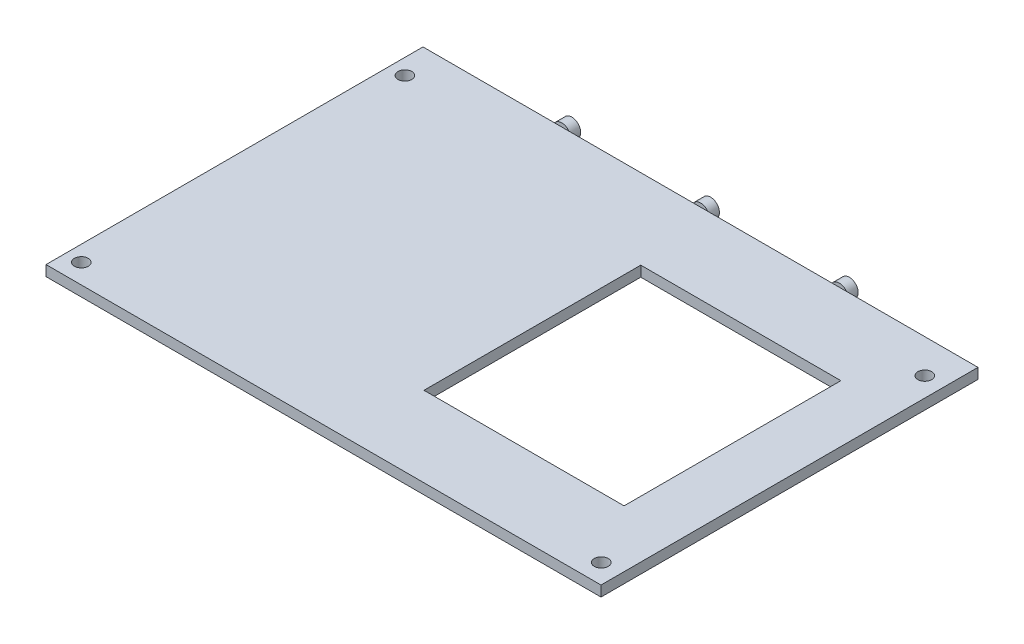
ISO-10303-21;
HEADER;
FILE_DESCRIPTION(('STEP AP214'),'2;1');
FILE_NAME('part.step','',(''),(''),'','','');
FILE_SCHEMA(('AUTOMOTIVE_DESIGN { 1 0 10303 214 1 1 1 1 }'));
ENDSEC;
DATA;
#1=APPLICATION_CONTEXT('core data for automotive mechanical design processes');
#2=APPLICATION_PROTOCOL_DEFINITION('international standard','automotive_design',2000,#1);
#3=PRODUCT_CONTEXT('',#1,'mechanical');
#4=PRODUCT('Part','Part','',(#3));
#5=PRODUCT_RELATED_PRODUCT_CATEGORY('part','',(#4));
#6=PRODUCT_DEFINITION_FORMATION('','',#4);
#7=PRODUCT_DEFINITION_CONTEXT('part definition',#1,'design');
#8=PRODUCT_DEFINITION('design','',#6,#7);
#9=PRODUCT_DEFINITION_SHAPE('','',#8);
#10=(LENGTH_UNIT() NAMED_UNIT(*) SI_UNIT(.MILLI.,.METRE.));
#11=(NAMED_UNIT(*) PLANE_ANGLE_UNIT() SI_UNIT($,.RADIAN.));
#12=(NAMED_UNIT(*) SI_UNIT($,.STERADIAN.) SOLID_ANGLE_UNIT());
#13=UNCERTAINTY_MEASURE_WITH_UNIT(LENGTH_MEASURE(1.E-05),#10,'distance_accuracy_value','');
#14=(GEOMETRIC_REPRESENTATION_CONTEXT(3) GLOBAL_UNCERTAINTY_ASSIGNED_CONTEXT((#13)) GLOBAL_UNIT_ASSIGNED_CONTEXT((#10,
#11,#12)) REPRESENTATION_CONTEXT('',''));
#15=CARTESIAN_POINT('',(0.,0.,0.));
#16=DIRECTION('',(0.,0.,1.));
#17=DIRECTION('',(1.,0.,0.));
#18=AXIS2_PLACEMENT_3D('',#15,#16,#17);
#19=CARTESIAN_POINT('',(0.,0.,0.));
#20=DIRECTION('',(0.,0.,1.));
#21=DIRECTION('',(1.,0.,0.));
#22=AXIS2_PLACEMENT_3D('',#19,#20,#21);
#23=PLANE('',#22);
#24=CARTESIAN_POINT('',(26.4999999999998,0.,0.));
#25=DIRECTION('',(0.,0.,-1.));
#26=DIRECTION('',(-1.,0.,0.));
#27=AXIS2_PLACEMENT_3D('',#24,#25,#26);
#28=CIRCLE('',#27,1.7);
#29=CARTESIAN_POINT('',(27.8747727084866,1.,0.));
#30=VERTEX_POINT('',#29);
#31=CARTESIAN_POINT('',(27.8747727084866,-1.,0.));
#32=VERTEX_POINT('',#31);
#33=EDGE_CURVE('E11',#30,#32,#28,.T.);
#34=ORIENTED_EDGE('',*,*,#33,.F.);
#35=DIRECTION('',(-1.,0.,0.));
#36=VECTOR('',#35,1.);
#37=CARTESIAN_POINT('',(-53.,1.,0.));
#38=LINE('',#37,#36);
#39=CARTESIAN_POINT('',(53.,1.,0.));
#40=VERTEX_POINT('',#39);
#41=EDGE_CURVE('E235',#40,#30,#38,.T.);
#42=ORIENTED_EDGE('',*,*,#41,.F.);
#43=DIRECTION('',(0.,1.,0.));
#44=VECTOR('',#43,1.);
#45=CARTESIAN_POINT('',(53.,1.,0.));
#46=LINE('',#45,#44);
#47=CARTESIAN_POINT('',(53.,-1.,0.));
#48=VERTEX_POINT('',#47);
#49=EDGE_CURVE('E219',#48,#40,#46,.T.);
#50=ORIENTED_EDGE('',*,*,#49,.F.);
#51=DIRECTION('',(1.,0.,0.));
#52=VECTOR('',#51,1.);
#53=CARTESIAN_POINT('',(-53.,-1.,0.));
#54=LINE('',#53,#52);
#55=EDGE_CURVE('E240',#32,#48,#54,.T.);
#56=ORIENTED_EDGE('',*,*,#55,.F.);
#57=EDGE_LOOP('',(#34,#42,#50,#56));
#58=FACE_BOUND('',#57,.T.);
#59=ADVANCED_FACE('F43',(#58),#23,.F.);
#60=CARTESIAN_POINT('',(-26.5000000000002,0.,0.));
#61=DIRECTION('',(0.,0.,-1.));
#62=DIRECTION('',(-1.,0.,0.));
#63=AXIS2_PLACEMENT_3D('',#60,#61,#62);
#64=CIRCLE('',#63,1.7);
#65=CARTESIAN_POINT('',(-25.1252272915134,1.,0.));
#66=VERTEX_POINT('',#65);
#67=CARTESIAN_POINT('',(-25.1252272915134,-1.,0.));
#68=VERTEX_POINT('',#67);
#69=EDGE_CURVE('E61',#66,#68,#64,.T.);
#70=ORIENTED_EDGE('',*,*,#69,.F.);
#71=CARTESIAN_POINT('',(-1.37477270848693,1.,0.));
#72=VERTEX_POINT('',#71);
#73=EDGE_CURVE('E151',#72,#66,#38,.T.);
#74=ORIENTED_EDGE('',*,*,#73,.F.);
#75=CARTESIAN_POINT('',(-1.80411241501588E-13,0.,0.));
#76=DIRECTION('',(0.,0.,-1.));
#77=DIRECTION('',(-1.,0.,0.));
#78=AXIS2_PLACEMENT_3D('',#75,#76,#77);
#79=CIRCLE('',#78,1.7);
#80=CARTESIAN_POINT('',(-1.37477270848694,-1.,0.));
#81=VERTEX_POINT('',#80);
#82=EDGE_CURVE('E160',#81,#72,#79,.T.);
#83=ORIENTED_EDGE('',*,*,#82,.F.);
#84=EDGE_CURVE('E361',#68,#81,#54,.T.);
#85=ORIENTED_EDGE('',*,*,#84,.F.);
#86=EDGE_LOOP('',(#70,#74,#83,#85));
#87=FACE_BOUND('',#86,.T.);
#88=ADVANCED_FACE('F159',(#87),#23,.F.);
#89=CARTESIAN_POINT('',(25.1252272915131,-1.,0.));
#90=VERTEX_POINT('',#89);
#91=CARTESIAN_POINT('',(25.1252272915131,1.,0.));
#92=VERTEX_POINT('',#91);
#93=EDGE_CURVE('E52',#90,#92,#28,.T.);
#94=ORIENTED_EDGE('',*,*,#93,.F.);
#95=CARTESIAN_POINT('',(1.37477270848658,-1.,0.));
#96=VERTEX_POINT('',#95);
#97=EDGE_CURVE('E325',#96,#90,#54,.T.);
#98=ORIENTED_EDGE('',*,*,#97,.F.);
#99=CARTESIAN_POINT('',(1.37477270848657,1.,0.));
#100=VERTEX_POINT('',#99);
#101=EDGE_CURVE('E69',#100,#96,#79,.T.);
#102=ORIENTED_EDGE('',*,*,#101,.F.);
#103=EDGE_CURVE('E153',#92,#100,#38,.T.);
#104=ORIENTED_EDGE('',*,*,#103,.F.);
#105=EDGE_LOOP('',(#94,#98,#102,#104));
#106=FACE_BOUND('',#105,.T.);
#107=ADVANCED_FACE('F300',(#106),#23,.F.);
#108=CARTESIAN_POINT('',(53.,1.,72.));
#109=DIRECTION('',(-1.,0.,0.));
#110=DIRECTION('',(0.,-1.,0.));
#111=AXIS2_PLACEMENT_3D('',#108,#109,#110);
#112=PLANE('',#111);
#113=ORIENTED_EDGE('',*,*,#49,.T.);
#114=DIRECTION('',(0.,0.,-1.));
#115=VECTOR('',#114,1.);
#116=CARTESIAN_POINT('',(53.,1.,72.));
#117=LINE('',#116,#115);
#118=CARTESIAN_POINT('',(53.,1.,72.));
#119=VERTEX_POINT('',#118);
#120=EDGE_CURVE('E252',#119,#40,#117,.T.);
#121=ORIENTED_EDGE('',*,*,#120,.F.);
#122=DIRECTION('',(0.,1.,0.));
#123=VECTOR('',#122,1.);
#124=CARTESIAN_POINT('',(53.,1.,72.));
#125=LINE('',#124,#123);
#126=CARTESIAN_POINT('',(53.,-1.,72.));
#127=VERTEX_POINT('',#126);
#128=EDGE_CURVE('E222',#127,#119,#125,.T.);
#129=ORIENTED_EDGE('',*,*,#128,.F.);
#130=DIRECTION('',(0.,0.,-1.));
#131=VECTOR('',#130,1.);
#132=CARTESIAN_POINT('',(53.,-1.,72.));
#133=LINE('',#132,#131);
#134=EDGE_CURVE('E232',#127,#48,#133,.T.);
#135=ORIENTED_EDGE('',*,*,#134,.T.);
#136=EDGE_LOOP('',(#113,#121,#129,#135));
#137=FACE_BOUND('',#136,.T.);
#138=ADVANCED_FACE('F45',(#137),#112,.F.);
#139=CARTESIAN_POINT('',(-53.,1.,72.));
#140=DIRECTION('',(0.,-1.,0.));
#141=DIRECTION('',(0.,0.,-1.));
#142=AXIS2_PLACEMENT_3D('',#139,#140,#141);
#143=PLANE('',#142);
#144=DIRECTION('',(-1.,0.,0.));
#145=VECTOR('',#144,1.);
#146=CARTESIAN_POINT('',(3.88949849527973,1.,15.2958453329513));
#147=LINE('',#146,#145);
#148=CARTESIAN_POINT('',(42.1105015047203,1.,15.2958453329513));
#149=VERTEX_POINT('',#148);
#150=CARTESIAN_POINT('',(3.88949849527973,1.,15.2958453329513));
#151=VERTEX_POINT('',#150);
#152=EDGE_CURVE('E179',#149,#151,#147,.T.);
#153=ORIENTED_EDGE('',*,*,#152,.F.);
#154=DIRECTION('',(0.,0.,-1.));
#155=VECTOR('',#154,1.);
#156=CARTESIAN_POINT('',(42.1105015047203,1.,15.2958453329513));
#157=LINE('',#156,#155);
#158=CARTESIAN_POINT('',(42.1105015047203,1.,56.7041546670487));
#159=VERTEX_POINT('',#158);
#160=EDGE_CURVE('E173',#159,#149,#157,.T.);
#161=ORIENTED_EDGE('',*,*,#160,.F.);
#162=DIRECTION('',(1.,0.,0.));
#163=VECTOR('',#162,1.);
#164=CARTESIAN_POINT('',(3.88949849527974,1.,56.7041546670487));
#165=LINE('',#164,#163);
#166=CARTESIAN_POINT('',(3.88949849527974,1.,56.7041546670487));
#167=VERTEX_POINT('',#166);
#168=EDGE_CURVE('E185',#167,#159,#165,.T.);
#169=ORIENTED_EDGE('',*,*,#168,.F.);
#170=DIRECTION('',(0.,0.,1.));
#171=VECTOR('',#170,1.);
#172=CARTESIAN_POINT('',(3.88949849527973,1.,15.2958453329513));
#173=LINE('',#172,#171);
#174=EDGE_CURVE('E182',#151,#167,#173,.T.);
#175=ORIENTED_EDGE('',*,*,#174,.F.);
#176=EDGE_LOOP('',(#153,#161,#169,#175));
#177=FACE_BOUND('',#176,.T.);
#178=CARTESIAN_POINT('',(49.2951219272078,1.,6.45069322686598));
#179=DIRECTION('',(0.,1.,0.));
#180=DIRECTION('',(0.,0.,1.));
#181=AXIS2_PLACEMENT_3D('',#178,#179,#180);
#182=CIRCLE('',#181,1.325);
#183=CARTESIAN_POINT('',(49.2951219272078,1.,7.77569322686598));
#184=VERTEX_POINT('',#183);
#185=EDGE_CURVE('E191',#184,#184,#182,.T.);
#186=ORIENTED_EDGE('',*,*,#185,.F.);
#187=EDGE_LOOP('',(#186));
#188=FACE_BOUND('',#187,.T.);
#189=CARTESIAN_POINT('',(49.2951219272078,1.,68.250693226866));
#190=DIRECTION('',(0.,1.,0.));
#191=DIRECTION('',(0.,0.,1.));
#192=AXIS2_PLACEMENT_3D('',#189,#190,#191);
#193=CIRCLE('',#192,1.325);
#194=CARTESIAN_POINT('',(49.2951219272078,1.,69.575693226866));
#195=VERTEX_POINT('',#194);
#196=EDGE_CURVE('E208',#195,#195,#193,.T.);
#197=ORIENTED_EDGE('',*,*,#196,.F.);
#198=EDGE_LOOP('',(#197));
#199=FACE_BOUND('',#198,.T.);
#200=CARTESIAN_POINT('',(-50.0048780727922,1.,68.250693226866));
#201=DIRECTION('',(0.,1.,0.));
#202=DIRECTION('',(0.,0.,1.));
#203=AXIS2_PLACEMENT_3D('',#200,#201,#202);
#204=CIRCLE('',#203,1.325);
#205=CARTESIAN_POINT('',(-50.0048780727922,1.,69.575693226866));
#206=VERTEX_POINT('',#205);
#207=EDGE_CURVE('E202',#206,#206,#204,.T.);
#208=ORIENTED_EDGE('',*,*,#207,.F.);
#209=EDGE_LOOP('',(#208));
#210=FACE_BOUND('',#209,.T.);
#211=CARTESIAN_POINT('',(-50.0048780727922,1.,6.45069322686598));
#212=DIRECTION('',(0.,1.,0.));
#213=DIRECTION('',(0.,0.,1.));
#214=AXIS2_PLACEMENT_3D('',#211,#212,#213);
#215=CIRCLE('',#214,1.325);
#216=CARTESIAN_POINT('',(-50.0048780727922,1.,7.77569322686598));
#217=VERTEX_POINT('',#216);
#218=EDGE_CURVE('E201',#217,#217,#215,.T.);
#219=ORIENTED_EDGE('',*,*,#218,.F.);
#220=EDGE_LOOP('',(#219));
#221=FACE_BOUND('',#220,.T.);
#222=ORIENTED_EDGE('',*,*,#41,.T.);
#223=EDGE_CURVE('E238',#30,#92,#38,.T.);
#224=ORIENTED_EDGE('',*,*,#223,.T.);
#225=ORIENTED_EDGE('',*,*,#103,.T.);
#226=EDGE_CURVE('E148',#100,#72,#38,.T.);
#227=ORIENTED_EDGE('',*,*,#226,.T.);
#228=ORIENTED_EDGE('',*,*,#73,.T.);
#229=CARTESIAN_POINT('',(-27.8747727084869,1.,0.));
#230=VERTEX_POINT('',#229);
#231=EDGE_CURVE('E162',#66,#230,#38,.T.);
#232=ORIENTED_EDGE('',*,*,#231,.T.);
#233=CARTESIAN_POINT('',(-53.,1.,0.));
#234=VERTEX_POINT('',#233);
#235=EDGE_CURVE('E234',#230,#234,#38,.T.);
#236=ORIENTED_EDGE('',*,*,#235,.T.);
#237=DIRECTION('',(0.,0.,-1.));
#238=VECTOR('',#237,1.);
#239=CARTESIAN_POINT('',(-53.,1.,72.));
#240=LINE('',#239,#238);
#241=CARTESIAN_POINT('',(-53.,1.,72.));
#242=VERTEX_POINT('',#241);
#243=EDGE_CURVE('E249',#242,#234,#240,.T.);
#244=ORIENTED_EDGE('',*,*,#243,.F.);
#245=DIRECTION('',(-1.,0.,0.));
#246=VECTOR('',#245,1.);
#247=CARTESIAN_POINT('',(-53.,1.,72.));
#248=LINE('',#247,#246);
#249=EDGE_CURVE('E225',#119,#242,#248,.T.);
#250=ORIENTED_EDGE('',*,*,#249,.F.);
#251=ORIENTED_EDGE('',*,*,#120,.T.);
#252=EDGE_LOOP('',(#222,#224,#225,#227,#228,#232,#236,#244,#250,#251));
#253=FACE_BOUND('',#252,.T.);
#254=ADVANCED_FACE('F150',(#177,#188,#199,#210,#221,#253),#143,.F.);
#255=CARTESIAN_POINT('',(-53.,1.,72.));
#256=DIRECTION('',(1.,0.,0.));
#257=DIRECTION('',(0.,0.,-1.));
#258=AXIS2_PLACEMENT_3D('',#255,#256,#257);
#259=PLANE('',#258);
#260=DIRECTION('',(0.,-1.,0.));
#261=VECTOR('',#260,1.);
#262=CARTESIAN_POINT('',(-53.,1.,0.));
#263=LINE('',#262,#261);
#264=CARTESIAN_POINT('',(-53.,-1.,0.));
#265=VERTEX_POINT('',#264);
#266=EDGE_CURVE('E237',#234,#265,#263,.T.);
#267=ORIENTED_EDGE('',*,*,#266,.T.);
#268=DIRECTION('',(0.,0.,-1.));
#269=VECTOR('',#268,1.);
#270=CARTESIAN_POINT('',(-53.,-1.,72.));
#271=LINE('',#270,#269);
#272=CARTESIAN_POINT('',(-53.,-1.,72.));
#273=VERTEX_POINT('',#272);
#274=EDGE_CURVE('E246',#273,#265,#271,.T.);
#275=ORIENTED_EDGE('',*,*,#274,.F.);
#276=DIRECTION('',(0.,-1.,0.));
#277=VECTOR('',#276,1.);
#278=CARTESIAN_POINT('',(-53.,1.,72.));
#279=LINE('',#278,#277);
#280=EDGE_CURVE('E228',#242,#273,#279,.T.);
#281=ORIENTED_EDGE('',*,*,#280,.F.);
#282=ORIENTED_EDGE('',*,*,#243,.T.);
#283=EDGE_LOOP('',(#267,#275,#281,#282));
#284=FACE_BOUND('',#283,.T.);
#285=ADVANCED_FACE('F547',(#284),#259,.F.);
#286=CARTESIAN_POINT('',(-53.,-1.,72.));
#287=DIRECTION('',(0.,1.,0.));
#288=DIRECTION('',(0.,0.,1.));
#289=AXIS2_PLACEMENT_3D('',#286,#287,#288);
#290=PLANE('',#289);
#291=DIRECTION('',(1.,0.,0.));
#292=VECTOR('',#291,1.);
#293=CARTESIAN_POINT('',(-53.,-1.,56.7041546670487));
#294=LINE('',#293,#292);
#295=CARTESIAN_POINT('',(3.88949849527974,-0.999999999999999,56.7041546670487));
#296=VERTEX_POINT('',#295);
#297=CARTESIAN_POINT('',(42.1105015047203,-0.999999999999999,56.7041546670487));
#298=VERTEX_POINT('',#297);
#299=EDGE_CURVE('E260',#296,#298,#294,.T.);
#300=ORIENTED_EDGE('',*,*,#299,.T.);
#301=DIRECTION('',(0.,0.,-1.));
#302=VECTOR('',#301,1.);
#303=CARTESIAN_POINT('',(42.1105015047203,-1.,72.));
#304=LINE('',#303,#302);
#305=CARTESIAN_POINT('',(42.1105015047203,-0.999999999999999,15.2958453329513));
#306=VERTEX_POINT('',#305);
#307=EDGE_CURVE('E47',#298,#306,#304,.T.);
#308=ORIENTED_EDGE('',*,*,#307,.T.);
#309=DIRECTION('',(-1.,0.,0.));
#310=VECTOR('',#309,1.);
#311=CARTESIAN_POINT('',(-53.,-1.,15.2958453329513));
#312=LINE('',#311,#310);
#313=CARTESIAN_POINT('',(3.88949849527973,-1.,15.2958453329513));
#314=VERTEX_POINT('',#313);
#315=EDGE_CURVE('E255',#306,#314,#312,.T.);
#316=ORIENTED_EDGE('',*,*,#315,.T.);
#317=DIRECTION('',(0.,0.,1.));
#318=VECTOR('',#317,1.);
#319=CARTESIAN_POINT('',(3.88949849527974,-1.,72.));
#320=LINE('',#319,#318);
#321=EDGE_CURVE('E258',#314,#296,#320,.T.);
#322=ORIENTED_EDGE('',*,*,#321,.T.);
#323=EDGE_LOOP('',(#300,#308,#316,#322));
#324=FACE_BOUND('',#323,.T.);
#325=CARTESIAN_POINT('',(49.2951219272078,-1.,6.45069322686598));
#326=DIRECTION('',(0.,1.,0.));
#327=DIRECTION('',(0.,0.,1.));
#328=AXIS2_PLACEMENT_3D('',#325,#326,#327);
#329=CIRCLE('',#328,1.325);
#330=CARTESIAN_POINT('',(49.2951219272078,-1.,7.77569322686598));
#331=VERTEX_POINT('',#330);
#332=EDGE_CURVE('E211',#331,#331,#329,.T.);
#333=ORIENTED_EDGE('',*,*,#332,.T.);
#334=EDGE_LOOP('',(#333));
#335=FACE_BOUND('',#334,.T.);
#336=CARTESIAN_POINT('',(49.2951219272078,-1.,68.250693226866));
#337=DIRECTION('',(0.,1.,0.));
#338=DIRECTION('',(0.,0.,1.));
#339=AXIS2_PLACEMENT_3D('',#336,#337,#338);
#340=CIRCLE('',#339,1.325);
#341=CARTESIAN_POINT('',(49.2951219272078,-1.,69.575693226866));
#342=VERTEX_POINT('',#341);
#343=EDGE_CURVE('E205',#342,#342,#340,.T.);
#344=ORIENTED_EDGE('',*,*,#343,.T.);
#345=EDGE_LOOP('',(#344));
#346=FACE_BOUND('',#345,.T.);
#347=CARTESIAN_POINT('',(-50.0048780727922,-1.,68.250693226866));
#348=DIRECTION('',(0.,1.,0.));
#349=DIRECTION('',(0.,0.,1.));
#350=AXIS2_PLACEMENT_3D('',#347,#348,#349);
#351=CIRCLE('',#350,1.325);
#352=CARTESIAN_POINT('',(-50.0048780727922,-1.,69.575693226866));
#353=VERTEX_POINT('',#352);
#354=EDGE_CURVE('E198',#353,#353,#351,.T.);
#355=ORIENTED_EDGE('',*,*,#354,.T.);
#356=EDGE_LOOP('',(#355));
#357=FACE_BOUND('',#356,.T.);
#358=CARTESIAN_POINT('',(-50.0048780727922,-1.,6.45069322686598));
#359=DIRECTION('',(0.,1.,0.));
#360=DIRECTION('',(0.,0.,1.));
#361=AXIS2_PLACEMENT_3D('',#358,#359,#360);
#362=CIRCLE('',#361,1.325);
#363=CARTESIAN_POINT('',(-50.0048780727922,-1.,7.77569322686598));
#364=VERTEX_POINT('',#363);
#365=EDGE_CURVE('E216',#364,#364,#362,.T.);
#366=ORIENTED_EDGE('',*,*,#365,.T.);
#367=EDGE_LOOP('',(#366));
#368=FACE_BOUND('',#367,.T.);
#369=CARTESIAN_POINT('',(-27.8747727084869,-1.,0.));
#370=VERTEX_POINT('',#369);
#371=EDGE_CURVE('E226',#265,#370,#54,.T.);
#372=ORIENTED_EDGE('',*,*,#371,.T.);
#373=EDGE_CURVE('E243',#370,#68,#54,.T.);
#374=ORIENTED_EDGE('',*,*,#373,.T.);
#375=ORIENTED_EDGE('',*,*,#84,.T.);
#376=EDGE_CURVE('E338',#81,#96,#54,.T.);
#377=ORIENTED_EDGE('',*,*,#376,.T.);
#378=ORIENTED_EDGE('',*,*,#97,.T.);
#379=EDGE_CURVE('E335',#90,#32,#54,.T.);
#380=ORIENTED_EDGE('',*,*,#379,.T.);
#381=ORIENTED_EDGE('',*,*,#55,.T.);
#382=ORIENTED_EDGE('',*,*,#134,.F.);
#383=DIRECTION('',(1.,0.,0.));
#384=VECTOR('',#383,1.);
#385=CARTESIAN_POINT('',(-53.,-1.,72.));
#386=LINE('',#385,#384);
#387=EDGE_CURVE('E230',#273,#127,#386,.T.);
#388=ORIENTED_EDGE('',*,*,#387,.F.);
#389=ORIENTED_EDGE('',*,*,#274,.T.);
#390=EDGE_LOOP('',(#372,#374,#375,#377,#378,#380,#381,#382,#388,#389));
#391=FACE_BOUND('',#390,.T.);
#392=ADVANCED_FACE('F264',(#324,#335,#346,#357,#368,#391),#290,.F.);
#393=CARTESIAN_POINT('',(0.,0.,72.));
#394=DIRECTION('',(0.,0.,1.));
#395=DIRECTION('',(1.,0.,0.));
#396=AXIS2_PLACEMENT_3D('',#393,#394,#395);
#397=PLANE('',#396);
#398=ORIENTED_EDGE('',*,*,#128,.T.);
#399=ORIENTED_EDGE('',*,*,#249,.T.);
#400=ORIENTED_EDGE('',*,*,#280,.T.);
#401=ORIENTED_EDGE('',*,*,#387,.T.);
#402=EDGE_LOOP('',(#398,#399,#400,#401));
#403=FACE_BOUND('',#402,.T.);
#404=ADVANCED_FACE('F305',(#403),#397,.T.);
#405=EDGE_CURVE('E350',#370,#230,#64,.T.);
#406=ORIENTED_EDGE('',*,*,#405,.F.);
#407=ORIENTED_EDGE('',*,*,#371,.F.);
#408=ORIENTED_EDGE('',*,*,#266,.F.);
#409=ORIENTED_EDGE('',*,*,#235,.F.);
#410=EDGE_LOOP('',(#406,#407,#408,#409));
#411=FACE_BOUND('',#410,.T.);
#412=ADVANCED_FACE('F296',(#411),#23,.F.);
#413=CARTESIAN_POINT('',(-50.0048780727922,-1.,6.45069322686598));
#414=DIRECTION('',(0.,1.,0.));
#415=DIRECTION('',(0.,0.,1.));
#416=AXIS2_PLACEMENT_3D('',#413,#414,#415);
#417=CYLINDRICAL_SURFACE('',#416,1.325);
#418=ORIENTED_EDGE('',*,*,#365,.F.);
#419=EDGE_LOOP('',(#418));
#420=FACE_BOUND('',#419,.T.);
#421=ORIENTED_EDGE('',*,*,#218,.T.);
#422=EDGE_LOOP('',(#421));
#423=FACE_BOUND('',#422,.T.);
#424=ADVANCED_FACE('F304',(#420,#423),#417,.F.);
#425=CARTESIAN_POINT('',(-50.0048780727922,-1.,68.250693226866));
#426=DIRECTION('',(0.,1.,0.));
#427=DIRECTION('',(0.,0.,1.));
#428=AXIS2_PLACEMENT_3D('',#425,#426,#427);
#429=CYLINDRICAL_SURFACE('',#428,1.325);
#430=ORIENTED_EDGE('',*,*,#354,.F.);
#431=EDGE_LOOP('',(#430));
#432=FACE_BOUND('',#431,.T.);
#433=ORIENTED_EDGE('',*,*,#207,.T.);
#434=EDGE_LOOP('',(#433));
#435=FACE_BOUND('',#434,.T.);
#436=ADVANCED_FACE('F312',(#432,#435),#429,.F.);
#437=CARTESIAN_POINT('',(49.2951219272078,-1.,68.250693226866));
#438=DIRECTION('',(0.,1.,0.));
#439=DIRECTION('',(0.,0.,1.));
#440=AXIS2_PLACEMENT_3D('',#437,#438,#439);
#441=CYLINDRICAL_SURFACE('',#440,1.325);
#442=ORIENTED_EDGE('',*,*,#343,.F.);
#443=EDGE_LOOP('',(#442));
#444=FACE_BOUND('',#443,.T.);
#445=ORIENTED_EDGE('',*,*,#196,.T.);
#446=EDGE_LOOP('',(#445));
#447=FACE_BOUND('',#446,.T.);
#448=ADVANCED_FACE('F509',(#444,#447),#441,.F.);
#449=CARTESIAN_POINT('',(49.2951219272078,-1.,6.45069322686598));
#450=DIRECTION('',(0.,1.,0.));
#451=DIRECTION('',(0.,0.,1.));
#452=AXIS2_PLACEMENT_3D('',#449,#450,#451);
#453=CYLINDRICAL_SURFACE('',#452,1.325);
#454=ORIENTED_EDGE('',*,*,#332,.F.);
#455=EDGE_LOOP('',(#454));
#456=FACE_BOUND('',#455,.T.);
#457=ORIENTED_EDGE('',*,*,#185,.T.);
#458=EDGE_LOOP('',(#457));
#459=FACE_BOUND('',#458,.T.);
#460=ADVANCED_FACE('F501',(#456,#459),#453,.F.);
#461=CARTESIAN_POINT('',(42.1105015047203,-9.,15.2958453329513));
#462=DIRECTION('',(1.,0.,0.));
#463=DIRECTION('',(0.,0.,-1.));
#464=AXIS2_PLACEMENT_3D('',#461,#462,#463);
#465=PLANE('',#464);
#466=DIRECTION('',(0.,1.,0.));
#467=VECTOR('',#466,1.);
#468=CARTESIAN_POINT('',(42.1105015047203,-9.,56.7041546670487));
#469=LINE('',#468,#467);
#470=EDGE_CURVE('E189',#298,#159,#469,.T.);
#471=ORIENTED_EDGE('',*,*,#470,.T.);
#472=ORIENTED_EDGE('',*,*,#160,.T.);
#473=DIRECTION('',(0.,1.,0.));
#474=VECTOR('',#473,1.);
#475=CARTESIAN_POINT('',(42.1105015047203,-9.,15.2958453329513));
#476=LINE('',#475,#474);
#477=EDGE_CURVE('E188',#306,#149,#476,.T.);
#478=ORIENTED_EDGE('',*,*,#477,.F.);
#479=ORIENTED_EDGE('',*,*,#307,.F.);
#480=EDGE_LOOP('',(#471,#472,#478,#479));
#481=FACE_BOUND('',#480,.T.);
#482=ADVANCED_FACE('F269',(#481),#465,.F.);
#483=CARTESIAN_POINT('',(3.88949849527974,-9.,56.7041546670487));
#484=DIRECTION('',(0.,0.,1.));
#485=DIRECTION('',(1.,0.,0.));
#486=AXIS2_PLACEMENT_3D('',#483,#484,#485);
#487=PLANE('',#486);
#488=DIRECTION('',(0.,1.,0.));
#489=VECTOR('',#488,1.);
#490=CARTESIAN_POINT('',(3.88949849527974,-9.,56.7041546670487));
#491=LINE('',#490,#489);
#492=EDGE_CURVE('E192',#296,#167,#491,.T.);
#493=ORIENTED_EDGE('',*,*,#492,.T.);
#494=ORIENTED_EDGE('',*,*,#168,.T.);
#495=ORIENTED_EDGE('',*,*,#470,.F.);
#496=ORIENTED_EDGE('',*,*,#299,.F.);
#497=EDGE_LOOP('',(#493,#494,#495,#496));
#498=FACE_BOUND('',#497,.T.);
#499=ADVANCED_FACE('F271',(#498),#487,.F.);
#500=CARTESIAN_POINT('',(3.88949849527973,-9.,15.2958453329513));
#501=DIRECTION('',(-1.,0.,0.));
#502=DIRECTION('',(0.,0.,1.));
#503=AXIS2_PLACEMENT_3D('',#500,#501,#502);
#504=PLANE('',#503);
#505=DIRECTION('',(0.,1.,0.));
#506=VECTOR('',#505,1.);
#507=CARTESIAN_POINT('',(3.88949849527973,-9.,15.2958453329513));
#508=LINE('',#507,#506);
#509=EDGE_CURVE('E194',#314,#151,#508,.T.);
#510=ORIENTED_EDGE('',*,*,#509,.T.);
#511=ORIENTED_EDGE('',*,*,#174,.T.);
#512=ORIENTED_EDGE('',*,*,#492,.F.);
#513=ORIENTED_EDGE('',*,*,#321,.F.);
#514=EDGE_LOOP('',(#510,#511,#512,#513));
#515=FACE_BOUND('',#514,.T.);
#516=ADVANCED_FACE('F283',(#515),#504,.F.);
#517=CARTESIAN_POINT('',(3.88949849527973,-9.,15.2958453329513));
#518=DIRECTION('',(0.,0.,-1.));
#519=DIRECTION('',(-1.,0.,0.));
#520=AXIS2_PLACEMENT_3D('',#517,#518,#519);
#521=PLANE('',#520);
#522=ORIENTED_EDGE('',*,*,#477,.T.);
#523=ORIENTED_EDGE('',*,*,#152,.T.);
#524=ORIENTED_EDGE('',*,*,#509,.F.);
#525=ORIENTED_EDGE('',*,*,#315,.F.);
#526=EDGE_LOOP('',(#522,#523,#524,#525));
#527=FACE_BOUND('',#526,.T.);
#528=ADVANCED_FACE('F280',(#527),#521,.F.);
#529=CARTESIAN_POINT('',(-1.80411241501588E-13,0.,0.));
#530=DIRECTION('',(0.,0.,-1.));
#531=DIRECTION('',(-1.,0.,0.));
#532=AXIS2_PLACEMENT_3D('',#529,#530,#531);
#533=PLANE('',#532);
#534=ORIENTED_EDGE('',*,*,#376,.F.);
#535=EDGE_CURVE('E168',#96,#81,#79,.T.);
#536=ORIENTED_EDGE('',*,*,#535,.F.);
#537=EDGE_LOOP('',(#534,#536));
#538=FACE_BOUND('',#537,.T.);
#539=ADVANCED_FACE('F290',(#538),#533,.F.);
#540=CARTESIAN_POINT('',(-1.80411241501588E-13,0.,-1.92));
#541=DIRECTION('',(0.,0.,1.));
#542=DIRECTION('',(1.,0.,0.));
#543=AXIS2_PLACEMENT_3D('',#540,#541,#542);
#544=CYLINDRICAL_SURFACE('',#543,1.7);
#545=CARTESIAN_POINT('',(-1.80411241501588E-13,0.,-1.92));
#546=DIRECTION('',(0.,0.,-1.));
#547=DIRECTION('',(-1.,0.,0.));
#548=AXIS2_PLACEMENT_3D('',#545,#546,#547);
#549=CIRCLE('',#548,1.7);
#550=CARTESIAN_POINT('',(-1.70000000000018,0.,-1.92));
#551=VERTEX_POINT('',#550);
#552=EDGE_CURVE('E171',#551,#551,#549,.T.);
#553=ORIENTED_EDGE('',*,*,#552,.F.);
#554=EDGE_LOOP('',(#553));
#555=FACE_BOUND('',#554,.T.);
#556=EDGE_CURVE('E166',#72,#100,#79,.T.);
#557=ORIENTED_EDGE('',*,*,#556,.T.);
#558=ORIENTED_EDGE('',*,*,#101,.T.);
#559=ORIENTED_EDGE('',*,*,#535,.T.);
#560=ORIENTED_EDGE('',*,*,#82,.T.);
#561=EDGE_LOOP('',(#557,#558,#559,#560));
#562=FACE_BOUND('',#561,.T.);
#563=ADVANCED_FACE('F165',(#555,#562),#544,.T.);
#564=CARTESIAN_POINT('',(-1.80411241501588E-13,0.,-1.92));
#565=DIRECTION('',(0.,0.,-1.));
#566=DIRECTION('',(-1.,0.,0.));
#567=AXIS2_PLACEMENT_3D('',#564,#565,#566);
#568=PLANE('',#567);
#569=ORIENTED_EDGE('',*,*,#552,.T.);
#570=EDGE_LOOP('',(#569));
#571=FACE_BOUND('',#570,.T.);
#572=ADVANCED_FACE('F367',(#571),#568,.T.);
#573=ORIENTED_EDGE('',*,*,#226,.F.);
#574=ORIENTED_EDGE('',*,*,#556,.F.);
#575=EDGE_LOOP('',(#573,#574));
#576=FACE_BOUND('',#575,.T.);
#577=ADVANCED_FACE('F170',(#576),#533,.F.);
#578=CARTESIAN_POINT('',(-26.5000000000002,0.,0.));
#579=DIRECTION('',(0.,0.,-1.));
#580=DIRECTION('',(-1.,0.,0.));
#581=AXIS2_PLACEMENT_3D('',#578,#579,#580);
#582=PLANE('',#581);
#583=ORIENTED_EDGE('',*,*,#373,.F.);
#584=EDGE_CURVE('E348',#68,#370,#64,.T.);
#585=ORIENTED_EDGE('',*,*,#584,.F.);
#586=EDGE_LOOP('',(#583,#585));
#587=FACE_BOUND('',#586,.T.);
#588=ADVANCED_FACE('F359',(#587),#582,.F.);
#589=CARTESIAN_POINT('',(-26.5000000000002,0.,-1.92));
#590=DIRECTION('',(0.,0.,1.));
#591=DIRECTION('',(1.,0.,0.));
#592=AXIS2_PLACEMENT_3D('',#589,#590,#591);
#593=CYLINDRICAL_SURFACE('',#592,1.7);
#594=CARTESIAN_POINT('',(-26.5000000000002,0.,-1.92));
#595=DIRECTION('',(0.,0.,-1.));
#596=DIRECTION('',(-1.,0.,0.));
#597=AXIS2_PLACEMENT_3D('',#594,#595,#596);
#598=CIRCLE('',#597,1.7);
#599=CARTESIAN_POINT('',(-28.2000000000002,0.,-1.92));
#600=VERTEX_POINT('',#599);
#601=EDGE_CURVE('E343',#600,#600,#598,.T.);
#602=ORIENTED_EDGE('',*,*,#601,.F.);
#603=EDGE_LOOP('',(#602));
#604=FACE_BOUND('',#603,.T.);
#605=EDGE_CURVE('E175',#230,#66,#64,.T.);
#606=ORIENTED_EDGE('',*,*,#605,.T.);
#607=ORIENTED_EDGE('',*,*,#69,.T.);
#608=ORIENTED_EDGE('',*,*,#584,.T.);
#609=ORIENTED_EDGE('',*,*,#405,.T.);
#610=EDGE_LOOP('',(#606,#607,#608,#609));
#611=FACE_BOUND('',#610,.T.);
#612=ADVANCED_FACE('F355',(#604,#611),#593,.T.);
#613=CARTESIAN_POINT('',(-26.5000000000002,0.,-1.92));
#614=DIRECTION('',(0.,0.,-1.));
#615=DIRECTION('',(-1.,0.,0.));
#616=AXIS2_PLACEMENT_3D('',#613,#614,#615);
#617=PLANE('',#616);
#618=ORIENTED_EDGE('',*,*,#601,.T.);
#619=EDGE_LOOP('',(#618));
#620=FACE_BOUND('',#619,.T.);
#621=ADVANCED_FACE('F393',(#620),#617,.T.);
#622=ORIENTED_EDGE('',*,*,#231,.F.);
#623=ORIENTED_EDGE('',*,*,#605,.F.);
#624=EDGE_LOOP('',(#622,#623));
#625=FACE_BOUND('',#624,.T.);
#626=ADVANCED_FACE('F377',(#625),#582,.F.);
#627=CARTESIAN_POINT('',(26.4999999999998,0.,0.));
#628=DIRECTION('',(0.,0.,-1.));
#629=DIRECTION('',(-1.,0.,0.));
#630=AXIS2_PLACEMENT_3D('',#627,#628,#629);
#631=PLANE('',#630);
#632=ORIENTED_EDGE('',*,*,#379,.F.);
#633=EDGE_CURVE('E54',#32,#90,#28,.T.);
#634=ORIENTED_EDGE('',*,*,#633,.F.);
#635=EDGE_LOOP('',(#632,#634));
#636=FACE_BOUND('',#635,.T.);
#637=ADVANCED_FACE('F340',(#636),#631,.F.);
#638=CARTESIAN_POINT('',(26.4999999999998,0.,-1.92));
#639=DIRECTION('',(0.,0.,1.));
#640=DIRECTION('',(1.,0.,0.));
#641=AXIS2_PLACEMENT_3D('',#638,#639,#640);
#642=CYLINDRICAL_SURFACE('',#641,1.7);
#643=CARTESIAN_POINT('',(26.4999999999998,0.,-1.92));
#644=DIRECTION('',(0.,0.,-1.));
#645=DIRECTION('',(-1.,0.,0.));
#646=AXIS2_PLACEMENT_3D('',#643,#644,#645);
#647=CIRCLE('',#646,1.7);
#648=CARTESIAN_POINT('',(24.7999999999998,0.,-1.92));
#649=VERTEX_POINT('',#648);
#650=EDGE_CURVE('E342',#649,#649,#647,.T.);
#651=ORIENTED_EDGE('',*,*,#650,.F.);
#652=EDGE_LOOP('',(#651));
#653=FACE_BOUND('',#652,.T.);
#654=EDGE_CURVE('E331',#92,#30,#28,.T.);
#655=ORIENTED_EDGE('',*,*,#654,.T.);
#656=ORIENTED_EDGE('',*,*,#33,.T.);
#657=ORIENTED_EDGE('',*,*,#633,.T.);
#658=ORIENTED_EDGE('',*,*,#93,.T.);
#659=EDGE_LOOP('',(#655,#656,#657,#658));
#660=FACE_BOUND('',#659,.T.);
#661=ADVANCED_FACE('F341',(#653,#660),#642,.T.);
#662=CARTESIAN_POINT('',(26.4999999999998,0.,-1.92));
#663=DIRECTION('',(0.,0.,-1.));
#664=DIRECTION('',(-1.,0.,0.));
#665=AXIS2_PLACEMENT_3D('',#662,#663,#664);
#666=PLANE('',#665);
#667=ORIENTED_EDGE('',*,*,#650,.T.);
#668=EDGE_LOOP('',(#667));
#669=FACE_BOUND('',#668,.T.);
#670=ADVANCED_FACE('F382',(#669),#666,.T.);
#671=ORIENTED_EDGE('',*,*,#223,.F.);
#672=ORIENTED_EDGE('',*,*,#654,.F.);
#673=EDGE_LOOP('',(#671,#672));
#674=FACE_BOUND('',#673,.T.);
#675=ADVANCED_FACE('F385',(#674),#631,.F.);
#676=CLOSED_SHELL('',(#59,#88,#107,#138,#254,#285,#392,#404,#412,#424,#436,#448,#460,#482,#499,
#516,#528,#539,#563,#572,#577,#588,#612,#621,#626,#637,#661,#670,#675));
#677=MANIFOLD_SOLID_BREP('B2',#676);
#678=ADVANCED_BREP_SHAPE_REPRESENTATION('',(#18,#677),#14);
#679=SHAPE_DEFINITION_REPRESENTATION(#9,#678);
ENDSEC;
END-ISO-10303-21;
